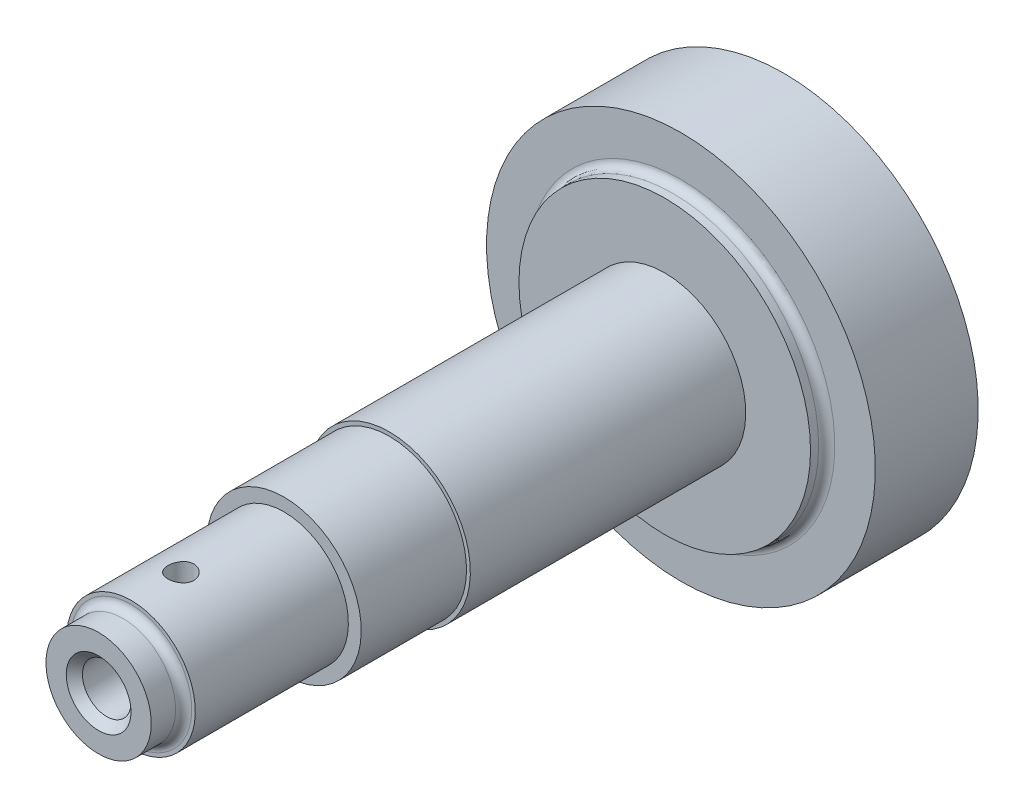
ISO-10303-21;
HEADER;
FILE_DESCRIPTION(('STEP AP214'),'2;1');
FILE_NAME('part.step','',(''),(''),'','','');
FILE_SCHEMA(('AUTOMOTIVE_DESIGN { 1 0 10303 214 1 1 1 1 }'));
ENDSEC;
DATA;
#1=APPLICATION_CONTEXT('core data for automotive mechanical design processes');
#2=APPLICATION_PROTOCOL_DEFINITION('international standard','automotive_design',2000,#1);
#3=PRODUCT_CONTEXT('',#1,'mechanical');
#4=PRODUCT('Part','Part','',(#3));
#5=PRODUCT_RELATED_PRODUCT_CATEGORY('part','',(#4));
#6=PRODUCT_DEFINITION_FORMATION('','',#4);
#7=PRODUCT_DEFINITION_CONTEXT('part definition',#1,'design');
#8=PRODUCT_DEFINITION('design','',#6,#7);
#9=PRODUCT_DEFINITION_SHAPE('','',#8);
#10=(LENGTH_UNIT() NAMED_UNIT(*) SI_UNIT(.MILLI.,.METRE.));
#11=(NAMED_UNIT(*) PLANE_ANGLE_UNIT() SI_UNIT($,.RADIAN.));
#12=(NAMED_UNIT(*) SI_UNIT($,.STERADIAN.) SOLID_ANGLE_UNIT());
#13=UNCERTAINTY_MEASURE_WITH_UNIT(LENGTH_MEASURE(1.E-05),#10,'distance_accuracy_value','');
#14=(GEOMETRIC_REPRESENTATION_CONTEXT(3) GLOBAL_UNCERTAINTY_ASSIGNED_CONTEXT((#13)) GLOBAL_UNIT_ASSIGNED_CONTEXT((#10,
#11,#12)) REPRESENTATION_CONTEXT('',''));
#15=CARTESIAN_POINT('',(0.,0.,0.));
#16=DIRECTION('',(0.,0.,1.));
#17=DIRECTION('',(1.,0.,0.));
#18=AXIS2_PLACEMENT_3D('',#15,#16,#17);
#19=CARTESIAN_POINT('',(0.,12.,-7.35));
#20=DIRECTION('',(0.,0.,-1.));
#21=DIRECTION('',(0.,1.,0.));
#22=AXIS2_PLACEMENT_3D('',#19,#20,#21);
#23=PLANE('',#22);
#24=CARTESIAN_POINT('',(0.,8.,-7.35));
#25=DIRECTION('',(0.,0.,-1.));
#26=DIRECTION('',(-1.,0.,0.));
#27=AXIS2_PLACEMENT_3D('',#24,#25,#26);
#28=CIRCLE('',#27,1.025);
#29=CARTESIAN_POINT('',(-1.025,8.,-7.35));
#30=VERTEX_POINT('',#29);
#31=EDGE_CURVE('E75',#30,#30,#28,.T.);
#32=ORIENTED_EDGE('',*,*,#31,.F.);
#33=EDGE_LOOP('',(#32));
#34=FACE_BOUND('',#33,.T.);
#35=CARTESIAN_POINT('',(6.92820323027551,4.,-7.35));
#36=DIRECTION('',(0.,0.,-1.));
#37=DIRECTION('',(-1.,0.,0.));
#38=AXIS2_PLACEMENT_3D('',#35,#36,#37);
#39=CIRCLE('',#38,1.025);
#40=CARTESIAN_POINT('',(5.90320323027551,4.,-7.35));
#41=VERTEX_POINT('',#40);
#42=EDGE_CURVE('E74',#41,#41,#39,.T.);
#43=ORIENTED_EDGE('',*,*,#42,.F.);
#44=EDGE_LOOP('',(#43));
#45=FACE_BOUND('',#44,.T.);
#46=CARTESIAN_POINT('',(6.92820323027551,-4.,-7.35));
#47=DIRECTION('',(0.,0.,-1.));
#48=DIRECTION('',(-1.,0.,0.));
#49=AXIS2_PLACEMENT_3D('',#46,#47,#48);
#50=CIRCLE('',#49,1.025);
#51=CARTESIAN_POINT('',(5.90320323027551,-4.,-7.35));
#52=VERTEX_POINT('',#51);
#53=EDGE_CURVE('E85',#52,#52,#50,.T.);
#54=ORIENTED_EDGE('',*,*,#53,.F.);
#55=EDGE_LOOP('',(#54));
#56=FACE_BOUND('',#55,.T.);
#57=CARTESIAN_POINT('',(0.,-8.,-7.35));
#58=DIRECTION('',(0.,0.,-1.));
#59=DIRECTION('',(-1.,0.,0.));
#60=AXIS2_PLACEMENT_3D('',#57,#58,#59);
#61=CIRCLE('',#60,1.025);
#62=CARTESIAN_POINT('',(-1.025,-8.,-7.35));
#63=VERTEX_POINT('',#62);
#64=EDGE_CURVE('E91',#63,#63,#61,.T.);
#65=ORIENTED_EDGE('',*,*,#64,.F.);
#66=EDGE_LOOP('',(#65));
#67=FACE_BOUND('',#66,.T.);
#68=CARTESIAN_POINT('',(-6.92820323027551,-4.,-7.35));
#69=DIRECTION('',(0.,0.,-1.));
#70=DIRECTION('',(-1.,0.,0.));
#71=AXIS2_PLACEMENT_3D('',#68,#69,#70);
#72=CIRCLE('',#71,1.025);
#73=CARTESIAN_POINT('',(-7.95320323027551,-4.,-7.35));
#74=VERTEX_POINT('',#73);
#75=EDGE_CURVE('E97',#74,#74,#72,.T.);
#76=ORIENTED_EDGE('',*,*,#75,.F.);
#77=EDGE_LOOP('',(#76));
#78=FACE_BOUND('',#77,.T.);
#79=CARTESIAN_POINT('',(-6.92820323027551,4.,-7.35));
#80=DIRECTION('',(0.,0.,-1.));
#81=DIRECTION('',(-1.,0.,0.));
#82=AXIS2_PLACEMENT_3D('',#79,#80,#81);
#83=CIRCLE('',#82,1.025);
#84=CARTESIAN_POINT('',(-7.95320323027551,4.,-7.35));
#85=VERTEX_POINT('',#84);
#86=EDGE_CURVE('E103',#85,#85,#83,.T.);
#87=ORIENTED_EDGE('',*,*,#86,.F.);
#88=EDGE_LOOP('',(#87));
#89=FACE_BOUND('',#88,.T.);
#90=CARTESIAN_POINT('',(0.,0.,-7.35));
#91=DIRECTION('',(0.,0.,-1.));
#92=DIRECTION('',(0.,1.,0.));
#93=AXIS2_PLACEMENT_3D('',#90,#91,#92);
#94=CIRCLE('',#93,12.);
#95=CARTESIAN_POINT('',(0.,12.,-7.35));
#96=VERTEX_POINT('',#95);
#97=EDGE_CURVE('E117',#96,#96,#94,.T.);
#98=ORIENTED_EDGE('',*,*,#97,.T.);
#99=EDGE_LOOP('',(#98));
#100=FACE_BOUND('',#99,.T.);
#101=ADVANCED_FACE('F37',(#34,#45,#56,#67,#78,#89,#100),#23,.T.);
#102=CARTESIAN_POINT('',(0.,0.,23.949));
#103=DIRECTION('',(0.,0.,1.));
#104=DIRECTION('',(0.,-1.,0.));
#105=AXIS2_PLACEMENT_3D('',#102,#103,#104);
#106=PLANE('',#105);
#107=CARTESIAN_POINT('',(0.,0.,23.949));
#108=DIRECTION('',(0.,0.,-1.));
#109=DIRECTION('',(0.,1.,0.));
#110=AXIS2_PLACEMENT_3D('',#107,#108,#109);
#111=CIRCLE('',#110,1.5);
#112=CARTESIAN_POINT('',(0.,1.5,23.949));
#113=VERTEX_POINT('',#112);
#114=EDGE_CURVE('E141',#113,#113,#111,.T.);
#115=ORIENTED_EDGE('',*,*,#114,.F.);
#116=EDGE_LOOP('',(#115));
#117=FACE_BOUND('',#116,.T.);
#118=ADVANCED_FACE('F151',(#117),#106,.T.);
#119=CARTESIAN_POINT('',(0.,0.,-7.35));
#120=DIRECTION('',(0.,0.,-1.));
#121=DIRECTION('',(0.,1.,0.));
#122=AXIS2_PLACEMENT_3D('',#119,#120,#121);
#123=CYLINDRICAL_SURFACE('',#122,1.5);
#124=CARTESIAN_POINT('',(0.,0.,34.449));
#125=DIRECTION('',(0.,0.,1.));
#126=DIRECTION('',(0.,-1.,0.));
#127=AXIS2_PLACEMENT_3D('',#124,#125,#126);
#128=CIRCLE('',#127,1.5);
#129=CARTESIAN_POINT('',(0.,-1.5,34.449));
#130=VERTEX_POINT('',#129);
#131=EDGE_CURVE('E11',#130,#130,#128,.T.);
#132=ORIENTED_EDGE('',*,*,#131,.T.);
#133=EDGE_LOOP('',(#132));
#134=FACE_BOUND('',#133,.T.);
#135=CARTESIAN_POINT('',(0.,1.5,30.669));
#136=CARTESIAN_POINT('',(-0.0417140042937087,1.49999758414449,30.6689972917102));
#137=CARTESIAN_POINT('',(-0.0834672912539163,1.49824189360224,30.6657184035876));
#138=CARTESIAN_POINT('',(-0.165718197334507,1.49139129667971,30.6527582991339));
#139=CARTESIAN_POINT('',(-0.206213769841146,1.48629121869364,30.6430671669965));
#140=CARTESIAN_POINT('',(-0.284638594945808,1.47328036800654,30.6177801601417));
#141=CARTESIAN_POINT('',(-0.322577512237569,1.465380979915,30.6022081858101));
#142=CARTESIAN_POINT('',(-0.395235474229208,1.4474774987237,30.565737448288));
#143=CARTESIAN_POINT('',(-0.42995450431626,1.43747339607276,30.5448386609244));
#144=CARTESIAN_POINT('',(-0.497767319459635,1.41547900666031,30.4967484382682));
#145=CARTESIAN_POINT('',(-0.530602027463181,1.4034011481073,30.4692323964802));
#146=CARTESIAN_POINT('',(-0.591434030661648,1.37887042167267,30.4093968543132));
#147=CARTESIAN_POINT('',(-0.619427089896361,1.36641723648963,30.3770731932663));
#148=CARTESIAN_POINT('',(-0.672354419511093,1.34122140682262,30.3050219415222));
#149=CARTESIAN_POINT('',(-0.696776837026739,1.32855595701366,30.2648879513369));
#150=CARTESIAN_POINT('',(-0.73842641631699,1.30586838669548,30.1803543186488));
#151=CARTESIAN_POINT('',(-0.755659138193525,1.29584422578236,30.1359580051932));
#152=CARTESIAN_POINT('',(-0.781243551670874,1.28057394848523,30.0469457306387));
#153=CARTESIAN_POINT('',(-0.790083117424783,1.27506829565278,30.0025170279096));
#154=CARTESIAN_POINT('',(-0.800094972405441,1.26881331156942,29.9124961280342));
#155=CARTESIAN_POINT('',(-0.801276946959546,1.26805797215382,29.8669054738658));
#156=CARTESIAN_POINT('',(-0.796296021649245,1.27118648805135,29.7827781343534));
#157=CARTESIAN_POINT('',(-0.791143222976698,1.2744325135639,29.7441515533778));
#158=CARTESIAN_POINT('',(-0.775413455073676,1.28406317281932,29.668425376058));
#159=CARTESIAN_POINT('',(-0.76483430375753,1.29044906914779,29.6313264004943));
#160=CARTESIAN_POINT('',(-0.738390252390656,1.30576277857079,29.5586619734264));
#161=CARTESIAN_POINT('',(-0.722411944930868,1.31474447400447,29.523149696915));
#162=CARTESIAN_POINT('',(-0.685716522966981,1.33425047082889,29.4551304736426));
#163=CARTESIAN_POINT('',(-0.664997308543684,1.34477545505385,29.422624867631));
#164=CARTESIAN_POINT('',(-0.615868522436837,1.36804524940245,29.3565141387867));
#165=CARTESIAN_POINT('',(-0.586776291159886,1.38088899493241,29.3234492647533));
#166=CARTESIAN_POINT('',(-0.523451373374347,1.40611558623123,29.2624246423101));
#167=CARTESIAN_POINT('',(-0.489215573049457,1.41849814710228,29.2344680092069));
#168=CARTESIAN_POINT('',(-0.414022077031174,1.44230010999534,29.1828622850858));
#169=CARTESIAN_POINT('',(-0.372785484410786,1.45361823088172,29.1595688918061));
#170=CARTESIAN_POINT('',(-0.28622685973614,1.47310395304255,29.1204521168231));
#171=CARTESIAN_POINT('',(-0.240908517249554,1.48127436501701,29.1046220679969));
#172=CARTESIAN_POINT('',(-0.151832213955903,1.4929099561423,29.0823223875927));
#173=CARTESIAN_POINT('',(-0.108300131382029,1.49673204992476,29.07513929869));
#174=CARTESIAN_POINT('',(-0.0204895975412021,1.50050221027201,29.0680524967996));
#175=CARTESIAN_POINT('',(0.0237884072844016,1.5004525171609,29.0681445741977));
#176=CARTESIAN_POINT('',(0.107545959760608,1.49667382258832,29.0752499288307));
#177=CARTESIAN_POINT('',(0.147096449267732,1.49327897244286,29.0816346407483));
#178=CARTESIAN_POINT('',(0.224469554831582,1.48362188327846,29.1001074420979));
#179=CARTESIAN_POINT('',(0.262291990687246,1.47735934596486,29.1121961248567));
#180=CARTESIAN_POINT('',(0.336250167522201,1.46232570811689,29.1419749424682));
#181=CARTESIAN_POINT('',(0.372320333376868,1.4534959496239,29.1597972349183));
#182=CARTESIAN_POINT('',(0.44106215741096,1.43413438081761,29.2003751543016));
#183=CARTESIAN_POINT('',(0.473732482002723,1.42360190671964,29.2231327063769));
#184=CARTESIAN_POINT('',(0.538489644606409,1.40047645695353,29.2757448011077));
#185=CARTESIAN_POINT('',(0.57013486510825,1.38778372966929,29.3060996673289));
#186=CARTESIAN_POINT('',(0.628109862741499,1.36252708549313,29.3716128359152));
#187=CARTESIAN_POINT('',(0.654434715474707,1.34996329805962,29.4067755382921));
#188=CARTESIAN_POINT('',(0.702740766308904,1.32549514327965,29.483826486175));
#189=CARTESIAN_POINT('',(0.724310244689168,1.31369210729127,29.5260081387794));
#190=CARTESIAN_POINT('',(0.759824848176566,1.29347935062968,29.6142100900862));
#191=CARTESIAN_POINT('',(0.773780830369474,1.28506480237657,29.6602248141217));
#192=CARTESIAN_POINT('',(0.792295451806944,1.27372513461019,29.7500138470975));
#193=CARTESIAN_POINT('',(0.797640611545236,1.27034308682665,29.7935661837155));
#194=CARTESIAN_POINT('',(0.801103834511677,1.26816359887642,29.8810603141804));
#195=CARTESIAN_POINT('',(0.799226824740032,1.26936303319563,29.9250018221226));
#196=CARTESIAN_POINT('',(0.789056350744171,1.27570247677833,30.0063463548581));
#197=CARTESIAN_POINT('',(0.781570591370396,1.28034575552508,30.0438948907275));
#198=CARTESIAN_POINT('',(0.761493436479315,1.29238691721072,30.1171339575411));
#199=CARTESIAN_POINT('',(0.748900147495975,1.29978582163339,30.1528237938842));
#200=CARTESIAN_POINT('',(0.718080352112412,1.3170766557443,30.2239047795466));
#201=CARTESIAN_POINT('',(0.699543207429625,1.32709848411839,30.2591285674158));
#202=CARTESIAN_POINT('',(0.657671226676279,1.34833960706443,30.3262019357598));
#203=CARTESIAN_POINT('',(0.634333807313358,1.35955954483521,30.3580496853594));
#204=CARTESIAN_POINT('',(0.57958360263346,1.38387269806828,30.4222730938803));
#205=CARTESIAN_POINT('',(0.547491018352172,1.39700212075101,30.4540587404488));
#206=CARTESIAN_POINT('',(0.478150164559813,1.42222830059072,30.5119722703881));
#207=CARTESIAN_POINT('',(0.440898582826818,1.43432438618419,30.5380964911038));
#208=CARTESIAN_POINT('',(0.361022002622193,1.45651015109521,30.5844339599367));
#209=CARTESIAN_POINT('',(0.318288665753903,1.4665441059256,30.6044886264249));
#210=CARTESIAN_POINT('',(0.229399331630392,1.48303856571174,30.6368536227339));
#211=CARTESIAN_POINT('',(0.183252846928629,1.48950860714735,30.6491846321223));
#212=CARTESIAN_POINT('',(0.113807677907479,1.49584776109146,30.6611926712721));
#213=CARTESIAN_POINT('',(0.0911777471195367,1.49739944315896,30.6641148842016));
#214=CARTESIAN_POINT('',(0.0457024774465205,1.49947623062919,30.6680193021585));
#215=CARTESIAN_POINT('',(0.0228571359907302,1.50000132376497,30.669001484004));
#216=CARTESIAN_POINT('',(0.,1.5,30.669));
#217=B_SPLINE_CURVE_WITH_KNOTS('',3,(#135,#136,#137,#138,#139,#140,#141,#142,#143,#144,#145,
#146,#147,#148,#149,#150,#151,#152,#153,#154,#155,#156,#157,#158,#159,#160,#161,#162,#163,#164,
#165,#166,#167,#168,#169,#170,#171,#172,#173,#174,#175,#176,#177,#178,#179,#180,#181,#182,#183,
#184,#185,#186,#187,#188,#189,#190,#191,#192,#193,#194,#195,#196,#197,#198,#199,#200,#201,#202,
#203,#204,#205,#206,#207,#208,#209,#210,#211,#212,#213,#214,#215,#216),.UNSPECIFIED.,.T.,.F.,(4,
2,2,2,2,2,2,2,2,2,2,2,2,2,2,2,2,2,2,2,2,2,2,2,2,2,2,2,2,2,2,2,2,2,2,2,2,2,2,2,4),(0.,
0.125049785968991,0.250293400579705,0.375033395431374,0.499773956363365,0.632758937517722,
0.765859685119305,0.911100210896846,1.05622820677189,1.19228300426692,1.3281656858967,
1.44492819552125,1.56173769541658,1.68117137196063,1.80065805275815,1.93770170276476,
2.07482865313355,2.22012229846779,2.36528590361977,2.49740165319179,2.62944095746672,
2.74950324975933,2.86957803367864,2.99264692026342,3.11576390008817,3.25213772585138,
3.38863720347792,3.5343258453474,3.67980618389776,3.81103787448888,3.94218005404201,
4.05738088818265,4.1726244687305,4.29529226385598,4.41802624681403,4.55851375899378,
4.69909188991151,4.84307664846749,4.98667423094962,5.05519428454417,5.12371515689629),.UNSPECIFIED.);
#218=CARTESIAN_POINT('',(0.,1.5,30.669));
#219=VERTEX_POINT('',#218);
#220=EDGE_CURVE('E109',#219,#219,#217,.T.);
#221=ORIENTED_EDGE('',*,*,#220,.F.);
#222=EDGE_LOOP('',(#221));
#223=FACE_BOUND('',#222,.T.);
#224=ORIENTED_EDGE('',*,*,#114,.T.);
#225=EDGE_LOOP('',(#224));
#226=FACE_BOUND('',#225,.T.);
#227=ADVANCED_FACE('F145',(#134,#223,#226),#123,.F.);
#228=CARTESIAN_POINT('',(0.,1.5,34.949));
#229=DIRECTION('',(0.,0.,1.));
#230=DIRECTION('',(0.,-1.,0.));
#231=AXIS2_PLACEMENT_3D('',#228,#229,#230);
#232=PLANE('',#231);
#233=CARTESIAN_POINT('',(0.,0.,34.949));
#234=DIRECTION('',(0.,0.,1.));
#235=DIRECTION('',(0.,-1.,0.));
#236=AXIS2_PLACEMENT_3D('',#233,#234,#235);
#237=CIRCLE('',#236,1.99999999999999);
#238=CARTESIAN_POINT('',(0.,-1.99999999999999,34.949));
#239=VERTEX_POINT('',#238);
#240=EDGE_CURVE('E45',#239,#239,#237,.F.);
#241=ORIENTED_EDGE('',*,*,#240,.T.);
#242=EDGE_LOOP('',(#241));
#243=FACE_BOUND('',#242,.T.);
#244=CARTESIAN_POINT('',(0.,0.,34.949));
#245=DIRECTION('',(0.,0.,-1.));
#246=DIRECTION('',(0.,1.,0.));
#247=AXIS2_PLACEMENT_3D('',#244,#245,#246);
#248=CIRCLE('',#247,3.25);
#249=CARTESIAN_POINT('',(0.,3.25,34.949));
#250=VERTEX_POINT('',#249);
#251=EDGE_CURVE('E176',#250,#250,#248,.T.);
#252=ORIENTED_EDGE('',*,*,#251,.F.);
#253=EDGE_LOOP('',(#252));
#254=FACE_BOUND('',#253,.T.);
#255=ADVANCED_FACE('F150',(#243,#254),#232,.T.);
#256=CARTESIAN_POINT('',(0.,0.,-7.35));
#257=DIRECTION('',(0.,0.,-1.));
#258=DIRECTION('',(0.,1.,0.));
#259=AXIS2_PLACEMENT_3D('',#256,#257,#258);
#260=CYLINDRICAL_SURFACE('',#259,3.25);
#261=ORIENTED_EDGE('',*,*,#251,.T.);
#262=EDGE_LOOP('',(#261));
#263=FACE_BOUND('',#262,.T.);
#264=CARTESIAN_POINT('',(0.,0.,33.449));
#265=DIRECTION('',(0.,0.,-1.));
#266=DIRECTION('',(0.,1.,0.));
#267=AXIS2_PLACEMENT_3D('',#264,#265,#266);
#268=CIRCLE('',#267,3.25);
#269=CARTESIAN_POINT('',(0.,3.25,33.449));
#270=VERTEX_POINT('',#269);
#271=EDGE_CURVE('E180',#270,#270,#268,.T.);
#272=ORIENTED_EDGE('',*,*,#271,.F.);
#273=EDGE_LOOP('',(#272));
#274=FACE_BOUND('',#273,.T.);
#275=ADVANCED_FACE('F281',(#263,#274),#260,.T.);
#276=CARTESIAN_POINT('',(0.,0.,33.449));
#277=DIRECTION('',(0.,0.,-1.));
#278=DIRECTION('',(0.,1.,0.));
#279=AXIS2_PLACEMENT_3D('',#276,#277,#278);
#280=TOROIDAL_SURFACE('',#279,3.75,0.5);
#281=ORIENTED_EDGE('',*,*,#271,.T.);
#282=EDGE_LOOP('',(#281));
#283=FACE_BOUND('',#282,.T.);
#284=CARTESIAN_POINT('',(0.,0.,32.949));
#285=DIRECTION('',(0.,0.,-1.));
#286=DIRECTION('',(0.,1.,0.));
#287=AXIS2_PLACEMENT_3D('',#284,#285,#286);
#288=CIRCLE('',#287,3.75);
#289=CARTESIAN_POINT('',(0.,3.75,32.949));
#290=VERTEX_POINT('',#289);
#291=EDGE_CURVE('E184',#290,#290,#288,.T.);
#292=ORIENTED_EDGE('',*,*,#291,.F.);
#293=EDGE_LOOP('',(#292));
#294=FACE_BOUND('',#293,.T.);
#295=ADVANCED_FACE('F269',(#283,#294),#280,.F.);
#296=CARTESIAN_POINT('',(0.,3.96875,32.949));
#297=DIRECTION('',(0.,0.,1.));
#298=DIRECTION('',(0.,-1.,0.));
#299=AXIS2_PLACEMENT_3D('',#296,#297,#298);
#300=PLANE('',#299);
#301=ORIENTED_EDGE('',*,*,#291,.T.);
#302=EDGE_LOOP('',(#301));
#303=FACE_BOUND('',#302,.T.);
#304=CARTESIAN_POINT('',(0.,0.,32.949));
#305=DIRECTION('',(0.,0.,-1.));
#306=DIRECTION('',(0.,1.,0.));
#307=AXIS2_PLACEMENT_3D('',#304,#305,#306);
#308=CIRCLE('',#307,3.96875);
#309=CARTESIAN_POINT('',(0.,3.96875,32.949));
#310=VERTEX_POINT('',#309);
#311=EDGE_CURVE('E189',#310,#310,#308,.T.);
#312=ORIENTED_EDGE('',*,*,#311,.F.);
#313=EDGE_LOOP('',(#312));
#314=FACE_BOUND('',#313,.T.);
#315=ADVANCED_FACE('F251',(#303,#314),#300,.T.);
#316=CARTESIAN_POINT('',(0.,0.,-7.35));
#317=DIRECTION('',(0.,0.,-1.));
#318=DIRECTION('',(0.,1.,0.));
#319=AXIS2_PLACEMENT_3D('',#316,#317,#318);
#320=CYLINDRICAL_SURFACE('',#319,3.96875);
#321=CARTESIAN_POINT('',(0.,3.96875,30.669));
#322=CARTESIAN_POINT('',(0.0444541325131263,3.96874917972368,30.6689983734452));
#323=CARTESIAN_POINT('',(0.0889287519163532,3.96799544147647,30.6652821627834));
#324=CARTESIAN_POINT('',(0.176620377392282,3.96506134119661,30.6505276051741));
#325=CARTESIAN_POINT('',(0.219836364442538,3.96287985501559,30.6394834884487));
#326=CARTESIAN_POINT('',(0.30373021727012,3.95733379644308,30.6104285582664));
#327=CARTESIAN_POINT('',(0.344410488237865,3.95397036589777,30.5924244669888));
#328=CARTESIAN_POINT('',(0.422170230076708,3.94642584265588,30.549980745993));
#329=CARTESIAN_POINT('',(0.459249905300921,3.94224479640402,30.5255414817981));
#330=CARTESIAN_POINT('',(0.52926830912868,3.93346077328702,30.4705650453066));
#331=CARTESIAN_POINT('',(0.562150415665662,3.92885323426177,30.4399564806299));
#332=CARTESIAN_POINT('',(0.622349940950375,3.91976862926178,30.3736637614671));
#333=CARTESIAN_POINT('',(0.649666920357432,3.91529157361198,30.3379792066327));
#334=CARTESIAN_POINT('',(0.698202481791069,3.90693026014619,30.2621392537192));
#335=CARTESIAN_POINT('',(0.719362301034582,3.90305187034338,30.2219455447723));
#336=CARTESIAN_POINT('',(0.754606398350748,3.89639186148149,30.1384821806222));
#337=CARTESIAN_POINT('',(0.768691387122708,3.89361013226384,30.0952128348795));
#338=CARTESIAN_POINT('',(0.789201916149975,3.88950458459641,30.0074360660993));
#339=CARTESIAN_POINT('',(0.795726874426773,3.88816186061306,29.9629527761464));
#340=CARTESIAN_POINT('',(0.801240950700578,3.88702945680866,29.8735041463847));
#341=CARTESIAN_POINT('',(0.80023085170416,3.88723961561955,29.8285388571477));
#342=CARTESIAN_POINT('',(0.7907838366177,3.88917206009037,29.7401309329034));
#343=CARTESIAN_POINT('',(0.782461011653263,3.89087111532675,29.6966755228377));
#344=CARTESIAN_POINT('',(0.758804941359501,3.89555332182969,29.6117907042034));
#345=CARTESIAN_POINT('',(0.743471356462156,3.89853653529438,29.5703613938771));
#346=CARTESIAN_POINT('',(0.706120429450749,3.90547460612912,29.4903766568778));
#347=CARTESIAN_POINT('',(0.684057975609696,3.90943598610665,29.4518428855182));
#348=CARTESIAN_POINT('',(0.63390740356565,3.91787986991113,29.3789816852474));
#349=CARTESIAN_POINT('',(0.605818582364538,3.92236243450824,29.3446547478136));
#350=CARTESIAN_POINT('',(0.543802314362468,3.93144417655352,29.2805234169565));
#351=CARTESIAN_POINT('',(0.509777520815182,3.93604398777063,29.2508131696174));
#352=CARTESIAN_POINT('',(0.437178352292627,3.94476693655068,29.1975068024737));
#353=CARTESIAN_POINT('',(0.398603917196791,3.94889006781319,29.1739107634777));
#354=CARTESIAN_POINT('',(0.317895040256712,3.95620547187481,29.1334847320935));
#355=CARTESIAN_POINT('',(0.275754999553424,3.95939624430597,29.1166656289688));
#356=CARTESIAN_POINT('',(0.189168769126507,3.96447605023394,29.0903719647451));
#357=CARTESIAN_POINT('',(0.144722863981678,3.96636524395639,29.0808964996191));
#358=CARTESIAN_POINT('',(0.0555954736539724,3.96860667771273,29.0696926683514));
#359=CARTESIAN_POINT('',(0.0109308049647924,3.96898447194806,29.0678354812751));
#360=CARTESIAN_POINT('',(-0.0780706372445678,3.96823156977253,29.0715738134645));
#361=CARTESIAN_POINT('',(-0.122407429356478,3.96710095956321,29.0771689068509));
#362=CARTESIAN_POINT('',(-0.209078065787509,3.96347428738186,29.0955459673644));
#363=CARTESIAN_POINT('',(-0.251426523260813,3.96099081182107,29.1082617173619));
#364=CARTESIAN_POINT('',(-0.333390150399398,3.95493590011774,29.1404466865194));
#365=CARTESIAN_POINT('',(-0.373005112612033,3.95136438151169,29.1599164175837));
#366=CARTESIAN_POINT('',(-0.448919655844769,3.94346596430025,29.2053345252058));
#367=CARTESIAN_POINT('',(-0.485171989173552,3.9391302410398,29.2313603071432));
#368=CARTESIAN_POINT('',(-0.552841038146448,3.93020487738891,29.2890482362495));
#369=CARTESIAN_POINT('',(-0.58425722586039,3.92561520935122,29.320710997958));
#370=CARTESIAN_POINT('',(-0.641860361887284,3.91661292911103,29.3893609283369));
#371=CARTESIAN_POINT('',(-0.667958809066858,3.91220415880397,29.4264229484407));
#372=CARTESIAN_POINT('',(-0.713560284116662,3.90414481285551,29.5044804060495));
#373=CARTESIAN_POINT('',(-0.733063578019794,3.90049420663386,29.5454756848105));
#374=CARTESIAN_POINT('',(-0.764800908719841,3.89439567184802,29.6300280577704));
#375=CARTESIAN_POINT('',(-0.777072941015104,3.89194146895412,29.6735704158814));
#376=CARTESIAN_POINT('',(-0.794114339170052,3.88850047136446,29.7621539967124));
#377=CARTESIAN_POINT('',(-0.798884700914311,3.88751348188968,29.8071950196662));
#378=CARTESIAN_POINT('',(-0.800750033239184,3.8871295954836,29.8966085225453));
#379=CARTESIAN_POINT('',(-0.797984886832986,3.8877037188876,29.9409780187958));
#380=CARTESIAN_POINT('',(-0.785166744058513,3.8903125557533,30.0286054728597));
#381=CARTESIAN_POINT('',(-0.775113808298105,3.89234725706832,30.0718634399138));
#382=CARTESIAN_POINT('',(-0.748068281845036,3.8976349367444,30.1559491065688));
#383=CARTESIAN_POINT('',(-0.731093104677784,3.90088485642229,30.1967826119693));
#384=CARTESIAN_POINT('',(-0.690701123162848,3.9082384891047,30.2750437801395));
#385=CARTESIAN_POINT('',(-0.667283767798066,3.91234227513541,30.3124711512086));
#386=CARTESIAN_POINT('',(-0.614195510506858,3.9210297479312,30.3835536051715));
#387=CARTESIAN_POINT('',(-0.584423694542847,3.92562049237832,30.4171324712213));
#388=CARTESIAN_POINT('',(-0.519679667473879,3.93471423427265,30.4788639735284));
#389=CARTESIAN_POINT('',(-0.48470626257864,3.93921721130777,30.5070153607378));
#390=CARTESIAN_POINT('',(-0.410103641549803,3.94768469080049,30.5573765379579));
#391=CARTESIAN_POINT('',(-0.370428764010117,3.95164294066083,30.5795197837093));
#392=CARTESIAN_POINT('',(-0.287852107257284,3.95851335091306,30.6167896141199));
#393=CARTESIAN_POINT('',(-0.244953260687329,3.9614264484122,30.6319224880011));
#394=CARTESIAN_POINT('',(-0.168301829740705,3.96531610318129,30.6518299774724));
#395=CARTESIAN_POINT('',(-0.134983949151324,3.96659624339982,30.6582571923016));
#396=CARTESIAN_POINT('',(-0.0677813371128765,3.96831349072551,30.6668427537295));
#397=CARTESIAN_POINT('',(-0.0338966242817849,3.96875062546711,30.6690012402608));
#398=CARTESIAN_POINT('',(0.,3.96875,30.669));
#399=B_SPLINE_CURVE_WITH_KNOTS('',3,(#321,#322,#323,#324,#325,#326,#327,#328,#329,#330,#331,
#332,#333,#334,#335,#336,#337,#338,#339,#340,#341,#342,#343,#344,#345,#346,#347,#348,#349,#350,
#351,#352,#353,#354,#355,#356,#357,#358,#359,#360,#361,#362,#363,#364,#365,#366,#367,#368,#369,
#370,#371,#372,#373,#374,#375,#376,#377,#378,#379,#380,#381,#382,#383,#384,#385,#386,#387,#388,
#389,#390,#391,#392,#393,#394,#395,#396,#397,#398),.UNSPECIFIED.,.T.,.F.,(4,2,2,2,2,2,2,2,2,2,2,
2,2,2,2,2,2,2,2,2,2,2,2,2,2,2,2,2,2,2,2,2,2,2,2,2,2,2,4),(0.,0.133238387862618,
0.266581808407222,0.399796761834612,0.533004150174661,0.66785206219706,0.802710615707569,
0.938816923247824,1.07490955554683,1.2091914300447,1.3434593508164,1.47566893288879,
1.60788491924588,1.74100755484278,1.874145728141,2.00971774433272,2.14529155222158,
2.28108234127666,2.41685641136233,2.55032490674934,2.68378577507268,2.81602568152115,
2.94827561301481,3.08216685186024,3.21607269638155,3.35205192660189,3.48802567108688,
3.62327844122572,3.75851325436142,3.89125486258965,4.02399536690379,4.15640399038496,
4.28882394266045,4.42352834547016,4.55826371144608,4.69443551776024,4.83048492241114,
4.93208356745346,5.03367888194883),.UNSPECIFIED.);
#400=CARTESIAN_POINT('',(0.,3.96875,30.669));
#401=VERTEX_POINT('',#400);
#402=EDGE_CURVE('E110',#401,#401,#399,.T.);
#403=ORIENTED_EDGE('',*,*,#402,.F.);
#404=EDGE_LOOP('',(#403));
#405=FACE_BOUND('',#404,.T.);
#406=ORIENTED_EDGE('',*,*,#311,.T.);
#407=EDGE_LOOP('',(#406));
#408=FACE_BOUND('',#407,.T.);
#409=CARTESIAN_POINT('',(0.,0.,23.5));
#410=DIRECTION('',(0.,0.,-1.));
#411=DIRECTION('',(0.,1.,0.));
#412=AXIS2_PLACEMENT_3D('',#409,#410,#411);
#413=CIRCLE('',#412,3.96875);
#414=CARTESIAN_POINT('',(0.,3.96875,23.5));
#415=VERTEX_POINT('',#414);
#416=EDGE_CURVE('E192',#415,#415,#413,.T.);
#417=ORIENTED_EDGE('',*,*,#416,.F.);
#418=EDGE_LOOP('',(#417));
#419=FACE_BOUND('',#418,.T.);
#420=ADVANCED_FACE('F119',(#405,#408,#419),#320,.T.);
#421=CARTESIAN_POINT('',(0.,4.7625,23.5));
#422=DIRECTION('',(0.,0.,1.));
#423=DIRECTION('',(0.,-1.,0.));
#424=AXIS2_PLACEMENT_3D('',#421,#422,#423);
#425=PLANE('',#424);
#426=ORIENTED_EDGE('',*,*,#416,.T.);
#427=EDGE_LOOP('',(#426));
#428=FACE_BOUND('',#427,.T.);
#429=CARTESIAN_POINT('',(0.,0.,23.5));
#430=DIRECTION('',(0.,0.,-1.));
#431=DIRECTION('',(0.,1.,0.));
#432=AXIS2_PLACEMENT_3D('',#429,#430,#431);
#433=CIRCLE('',#432,4.7625);
#434=CARTESIAN_POINT('',(0.,4.7625,23.5));
#435=VERTEX_POINT('',#434);
#436=EDGE_CURVE('E195',#435,#435,#433,.T.);
#437=ORIENTED_EDGE('',*,*,#436,.F.);
#438=EDGE_LOOP('',(#437));
#439=FACE_BOUND('',#438,.T.);
#440=ADVANCED_FACE('F244',(#428,#439),#425,.T.);
#441=CARTESIAN_POINT('',(0.,0.,-7.35));
#442=DIRECTION('',(0.,0.,-1.));
#443=DIRECTION('',(0.,1.,0.));
#444=AXIS2_PLACEMENT_3D('',#441,#442,#443);
#445=CYLINDRICAL_SURFACE('',#444,4.7625);
#446=ORIENTED_EDGE('',*,*,#436,.T.);
#447=EDGE_LOOP('',(#446));
#448=FACE_BOUND('',#447,.T.);
#449=CARTESIAN_POINT('',(0.,0.,17.));
#450=DIRECTION('',(0.,0.,-1.));
#451=DIRECTION('',(0.,1.,0.));
#452=AXIS2_PLACEMENT_3D('',#449,#450,#451);
#453=CIRCLE('',#452,4.7625);
#454=CARTESIAN_POINT('',(0.,4.7625,17.));
#455=VERTEX_POINT('',#454);
#456=EDGE_CURVE('E198',#455,#455,#453,.T.);
#457=ORIENTED_EDGE('',*,*,#456,.F.);
#458=EDGE_LOOP('',(#457));
#459=FACE_BOUND('',#458,.T.);
#460=ADVANCED_FACE('F241',(#448,#459),#445,.T.);
#461=CARTESIAN_POINT('',(0.,5.,17.));
#462=DIRECTION('',(0.,0.,1.));
#463=DIRECTION('',(0.,-1.,0.));
#464=AXIS2_PLACEMENT_3D('',#461,#462,#463);
#465=PLANE('',#464);
#466=ORIENTED_EDGE('',*,*,#456,.T.);
#467=EDGE_LOOP('',(#466));
#468=FACE_BOUND('',#467,.T.);
#469=CARTESIAN_POINT('',(0.,0.,17.));
#470=DIRECTION('',(0.,0.,-1.));
#471=DIRECTION('',(0.,1.,0.));
#472=AXIS2_PLACEMENT_3D('',#469,#470,#471);
#473=CIRCLE('',#472,5.);
#474=CARTESIAN_POINT('',(0.,5.,17.));
#475=VERTEX_POINT('',#474);
#476=EDGE_CURVE('E201',#475,#475,#473,.T.);
#477=ORIENTED_EDGE('',*,*,#476,.F.);
#478=EDGE_LOOP('',(#477));
#479=FACE_BOUND('',#478,.T.);
#480=ADVANCED_FACE('F237',(#468,#479),#465,.T.);
#481=CARTESIAN_POINT('',(0.,0.,-7.35));
#482=DIRECTION('',(0.,0.,-1.));
#483=DIRECTION('',(0.,1.,0.));
#484=AXIS2_PLACEMENT_3D('',#481,#482,#483);
#485=CYLINDRICAL_SURFACE('',#484,5.);
#486=ORIENTED_EDGE('',*,*,#476,.T.);
#487=EDGE_LOOP('',(#486));
#488=FACE_BOUND('',#487,.T.);
#489=CARTESIAN_POINT('',(0.,0.,0.));
#490=DIRECTION('',(0.,0.,-1.));
#491=DIRECTION('',(0.,1.,0.));
#492=AXIS2_PLACEMENT_3D('',#489,#490,#491);
#493=CIRCLE('',#492,5.);
#494=CARTESIAN_POINT('',(0.,5.,0.));
#495=VERTEX_POINT('',#494);
#496=EDGE_CURVE('E204',#495,#495,#493,.T.);
#497=ORIENTED_EDGE('',*,*,#496,.F.);
#498=EDGE_LOOP('',(#497));
#499=FACE_BOUND('',#498,.T.);
#500=ADVANCED_FACE('F233',(#488,#499),#485,.T.);
#501=CARTESIAN_POINT('',(0.,9.,0.));
#502=DIRECTION('',(0.,0.,1.));
#503=DIRECTION('',(0.,-1.,0.));
#504=AXIS2_PLACEMENT_3D('',#501,#502,#503);
#505=PLANE('',#504);
#506=ORIENTED_EDGE('',*,*,#496,.T.);
#507=EDGE_LOOP('',(#506));
#508=FACE_BOUND('',#507,.T.);
#509=CARTESIAN_POINT('',(0.,0.,0.));
#510=DIRECTION('',(0.,0.,-1.));
#511=DIRECTION('',(0.,1.,0.));
#512=AXIS2_PLACEMENT_3D('',#509,#510,#511);
#513=CIRCLE('',#512,9.);
#514=CARTESIAN_POINT('',(0.,9.,0.));
#515=VERTEX_POINT('',#514);
#516=EDGE_CURVE('E207',#515,#515,#513,.T.);
#517=ORIENTED_EDGE('',*,*,#516,.F.);
#518=EDGE_LOOP('',(#517));
#519=FACE_BOUND('',#518,.T.);
#520=ADVANCED_FACE('F226',(#508,#519),#505,.T.);
#521=CARTESIAN_POINT('',(0.,0.,-7.35));
#522=DIRECTION('',(0.,0.,-1.));
#523=DIRECTION('',(0.,1.,0.));
#524=AXIS2_PLACEMENT_3D('',#521,#522,#523);
#525=CYLINDRICAL_SURFACE('',#524,9.);
#526=CARTESIAN_POINT('',(0.,0.,-0.5));
#527=DIRECTION('',(0.,0.,1.));
#528=DIRECTION('',(0.,-1.,0.));
#529=AXIS2_PLACEMENT_3D('',#526,#527,#528);
#530=CIRCLE('',#529,9.);
#531=CARTESIAN_POINT('',(0.,-9.,-0.5));
#532=VERTEX_POINT('',#531);
#533=EDGE_CURVE('E171',#532,#532,#530,.T.);
#534=ORIENTED_EDGE('',*,*,#533,.T.);
#535=EDGE_LOOP('',(#534));
#536=FACE_BOUND('',#535,.T.);
#537=ORIENTED_EDGE('',*,*,#516,.T.);
#538=EDGE_LOOP('',(#537));
#539=FACE_BOUND('',#538,.T.);
#540=ADVANCED_FACE('F222',(#536,#539),#525,.T.);
#541=CARTESIAN_POINT('',(0.,9.,-1.));
#542=DIRECTION('',(0.,0.,1.));
#543=DIRECTION('',(0.,-1.,0.));
#544=AXIS2_PLACEMENT_3D('',#541,#542,#543);
#545=PLANE('',#544);
#546=CARTESIAN_POINT('',(0.,0.,-1.));
#547=DIRECTION('',(0.,0.,1.));
#548=DIRECTION('',(0.,-1.,0.));
#549=AXIS2_PLACEMENT_3D('',#546,#547,#548);
#550=CIRCLE('',#549,9.5);
#551=CARTESIAN_POINT('',(0.,-9.5,-1.));
#552=VERTEX_POINT('',#551);
#553=EDGE_CURVE('E143',#552,#552,#550,.F.);
#554=ORIENTED_EDGE('',*,*,#553,.T.);
#555=EDGE_LOOP('',(#554));
#556=FACE_BOUND('',#555,.T.);
#557=CARTESIAN_POINT('',(0.,0.,-1.));
#558=DIRECTION('',(0.,0.,-1.));
#559=DIRECTION('',(0.,1.,0.));
#560=AXIS2_PLACEMENT_3D('',#557,#558,#559);
#561=CIRCLE('',#560,12.);
#562=CARTESIAN_POINT('',(0.,12.,-1.));
#563=VERTEX_POINT('',#562);
#564=EDGE_CURVE('E209',#563,#563,#561,.T.);
#565=ORIENTED_EDGE('',*,*,#564,.F.);
#566=EDGE_LOOP('',(#565));
#567=FACE_BOUND('',#566,.T.);
#568=ADVANCED_FACE('F218',(#556,#567),#545,.T.);
#569=CARTESIAN_POINT('',(0.,0.,-7.35));
#570=DIRECTION('',(0.,0.,-1.));
#571=DIRECTION('',(0.,1.,0.));
#572=AXIS2_PLACEMENT_3D('',#569,#570,#571);
#573=CYLINDRICAL_SURFACE('',#572,12.);
#574=ORIENTED_EDGE('',*,*,#564,.T.);
#575=EDGE_LOOP('',(#574));
#576=FACE_BOUND('',#575,.T.);
#577=ORIENTED_EDGE('',*,*,#97,.F.);
#578=EDGE_LOOP('',(#577));
#579=FACE_BOUND('',#578,.T.);
#580=ADVANCED_FACE('F129',(#576,#579),#573,.T.);
#581=CARTESIAN_POINT('',(0.,0.,29.869));
#582=DIRECTION('',(0.,-1.,0.));
#583=DIRECTION('',(0.,0.,-1.));
#584=AXIS2_PLACEMENT_3D('',#581,#582,#583);
#585=CYLINDRICAL_SURFACE('',#584,0.799999999999993);
#586=ORIENTED_EDGE('',*,*,#402,.T.);
#587=EDGE_LOOP('',(#586));
#588=FACE_BOUND('',#587,.T.);
#589=ORIENTED_EDGE('',*,*,#220,.T.);
#590=EDGE_LOOP('',(#589));
#591=FACE_BOUND('',#590,.T.);
#592=ADVANCED_FACE('F123',(#588,#591),#585,.F.);
#593=CARTESIAN_POINT('',(-6.92820323027551,4.,-2.));
#594=DIRECTION('',(0.,0.,-1.));
#595=DIRECTION('',(-1.,0.,0.));
#596=AXIS2_PLACEMENT_3D('',#593,#594,#595);
#597=CONICAL_SURFACE('',#596,1.025,1.02974425867665);
#598=CARTESIAN_POINT('',(-6.92820323027551,4.,-1.38411786549675));
#599=VERTEX_POINT('',#598);
#600=VERTEX_LOOP('',#599);
#601=FACE_BOUND('',#600,.T.);
#602=CARTESIAN_POINT('',(-6.92820323027551,4.,-2.));
#603=DIRECTION('',(0.,0.,-1.));
#604=DIRECTION('',(-1.,0.,0.));
#605=AXIS2_PLACEMENT_3D('',#602,#603,#604);
#606=CIRCLE('',#605,1.025);
#607=CARTESIAN_POINT('',(-7.95320323027551,4.,-2.));
#608=VERTEX_POINT('',#607);
#609=EDGE_CURVE('E106',#608,#608,#606,.T.);
#610=ORIENTED_EDGE('',*,*,#609,.T.);
#611=EDGE_LOOP('',(#610));
#612=FACE_BOUND('',#611,.T.);
#613=ADVANCED_FACE('F128',(#601,#612),#597,.F.);
#614=CARTESIAN_POINT('',(-6.92820323027551,4.,-7.35));
#615=DIRECTION('',(0.,0.,-1.));
#616=DIRECTION('',(-1.,0.,0.));
#617=AXIS2_PLACEMENT_3D('',#614,#615,#616);
#618=CYLINDRICAL_SURFACE('',#617,1.025);
#619=ORIENTED_EDGE('',*,*,#609,.F.);
#620=EDGE_LOOP('',(#619));
#621=FACE_BOUND('',#620,.T.);
#622=ORIENTED_EDGE('',*,*,#86,.T.);
#623=EDGE_LOOP('',(#622));
#624=FACE_BOUND('',#623,.T.);
#625=ADVANCED_FACE('F398',(#621,#624),#618,.F.);
#626=CARTESIAN_POINT('',(-6.92820323027551,-4.,-2.));
#627=DIRECTION('',(0.,0.,-1.));
#628=DIRECTION('',(-1.,0.,0.));
#629=AXIS2_PLACEMENT_3D('',#626,#627,#628);
#630=CONICAL_SURFACE('',#629,1.025,1.02974425867665);
#631=CARTESIAN_POINT('',(-6.92820323027551,-4.,-1.38411786549675));
#632=VERTEX_POINT('',#631);
#633=VERTEX_LOOP('',#632);
#634=FACE_BOUND('',#633,.T.);
#635=CARTESIAN_POINT('',(-6.92820323027551,-4.,-2.));
#636=DIRECTION('',(0.,0.,-1.));
#637=DIRECTION('',(-1.,0.,0.));
#638=AXIS2_PLACEMENT_3D('',#635,#636,#637);
#639=CIRCLE('',#638,1.025);
#640=CARTESIAN_POINT('',(-7.95320323027551,-4.,-2.));
#641=VERTEX_POINT('',#640);
#642=EDGE_CURVE('E100',#641,#641,#639,.T.);
#643=ORIENTED_EDGE('',*,*,#642,.T.);
#644=EDGE_LOOP('',(#643));
#645=FACE_BOUND('',#644,.T.);
#646=ADVANCED_FACE('F388',(#634,#645),#630,.F.);
#647=CARTESIAN_POINT('',(-6.92820323027551,-4.,-7.35));
#648=DIRECTION('',(0.,0.,-1.));
#649=DIRECTION('',(-1.,0.,0.));
#650=AXIS2_PLACEMENT_3D('',#647,#648,#649);
#651=CYLINDRICAL_SURFACE('',#650,1.025);
#652=ORIENTED_EDGE('',*,*,#642,.F.);
#653=EDGE_LOOP('',(#652));
#654=FACE_BOUND('',#653,.T.);
#655=ORIENTED_EDGE('',*,*,#75,.T.);
#656=EDGE_LOOP('',(#655));
#657=FACE_BOUND('',#656,.T.);
#658=ADVANCED_FACE('F379',(#654,#657),#651,.F.);
#659=CARTESIAN_POINT('',(0.,-8.,-2.));
#660=DIRECTION('',(0.,0.,-1.));
#661=DIRECTION('',(-1.,0.,0.));
#662=AXIS2_PLACEMENT_3D('',#659,#660,#661);
#663=CONICAL_SURFACE('',#662,1.025,1.02974425867665);
#664=CARTESIAN_POINT('',(0.,-8.,-1.38411786549675));
#665=VERTEX_POINT('',#664);
#666=VERTEX_LOOP('',#665);
#667=FACE_BOUND('',#666,.T.);
#668=CARTESIAN_POINT('',(0.,-8.,-2.));
#669=DIRECTION('',(0.,0.,-1.));
#670=DIRECTION('',(-1.,0.,0.));
#671=AXIS2_PLACEMENT_3D('',#668,#669,#670);
#672=CIRCLE('',#671,1.025);
#673=CARTESIAN_POINT('',(-1.025,-8.,-2.));
#674=VERTEX_POINT('',#673);
#675=EDGE_CURVE('E94',#674,#674,#672,.T.);
#676=ORIENTED_EDGE('',*,*,#675,.T.);
#677=EDGE_LOOP('',(#676));
#678=FACE_BOUND('',#677,.T.);
#679=ADVANCED_FACE('F369',(#667,#678),#663,.F.);
#680=CARTESIAN_POINT('',(0.,-8.,-7.35));
#681=DIRECTION('',(0.,0.,-1.));
#682=DIRECTION('',(-1.,0.,0.));
#683=AXIS2_PLACEMENT_3D('',#680,#681,#682);
#684=CYLINDRICAL_SURFACE('',#683,1.025);
#685=ORIENTED_EDGE('',*,*,#675,.F.);
#686=EDGE_LOOP('',(#685));
#687=FACE_BOUND('',#686,.T.);
#688=ORIENTED_EDGE('',*,*,#64,.T.);
#689=EDGE_LOOP('',(#688));
#690=FACE_BOUND('',#689,.T.);
#691=ADVANCED_FACE('F360',(#687,#690),#684,.F.);
#692=CARTESIAN_POINT('',(6.92820323027551,-4.,-2.));
#693=DIRECTION('',(0.,0.,-1.));
#694=DIRECTION('',(-1.,0.,0.));
#695=AXIS2_PLACEMENT_3D('',#692,#693,#694);
#696=CONICAL_SURFACE('',#695,1.025,1.02974425867665);
#697=CARTESIAN_POINT('',(6.92820323027551,-4.,-1.38411786549675));
#698=VERTEX_POINT('',#697);
#699=VERTEX_LOOP('',#698);
#700=FACE_BOUND('',#699,.T.);
#701=CARTESIAN_POINT('',(6.92820323027551,-4.,-2.));
#702=DIRECTION('',(0.,0.,-1.));
#703=DIRECTION('',(-1.,0.,0.));
#704=AXIS2_PLACEMENT_3D('',#701,#702,#703);
#705=CIRCLE('',#704,1.025);
#706=CARTESIAN_POINT('',(5.90320323027551,-4.,-2.));
#707=VERTEX_POINT('',#706);
#708=EDGE_CURVE('E88',#707,#707,#705,.T.);
#709=ORIENTED_EDGE('',*,*,#708,.T.);
#710=EDGE_LOOP('',(#709));
#711=FACE_BOUND('',#710,.T.);
#712=ADVANCED_FACE('F350',(#700,#711),#696,.F.);
#713=CARTESIAN_POINT('',(6.92820323027551,-4.,-7.35));
#714=DIRECTION('',(0.,0.,-1.));
#715=DIRECTION('',(-1.,0.,0.));
#716=AXIS2_PLACEMENT_3D('',#713,#714,#715);
#717=CYLINDRICAL_SURFACE('',#716,1.025);
#718=ORIENTED_EDGE('',*,*,#708,.F.);
#719=EDGE_LOOP('',(#718));
#720=FACE_BOUND('',#719,.T.);
#721=ORIENTED_EDGE('',*,*,#53,.T.);
#722=EDGE_LOOP('',(#721));
#723=FACE_BOUND('',#722,.T.);
#724=ADVANCED_FACE('F341',(#720,#723),#717,.F.);
#725=CARTESIAN_POINT('',(6.92820323027551,4.,-2.));
#726=DIRECTION('',(0.,0.,-1.));
#727=DIRECTION('',(-1.,0.,0.));
#728=AXIS2_PLACEMENT_3D('',#725,#726,#727);
#729=CONICAL_SURFACE('',#728,1.025,1.02974425867665);
#730=CARTESIAN_POINT('',(6.92820323027551,4.,-1.38411786549675));
#731=VERTEX_POINT('',#730);
#732=VERTEX_LOOP('',#731);
#733=FACE_BOUND('',#732,.T.);
#734=CARTESIAN_POINT('',(6.92820323027551,4.,-2.));
#735=DIRECTION('',(0.,0.,-1.));
#736=DIRECTION('',(-1.,0.,0.));
#737=AXIS2_PLACEMENT_3D('',#734,#735,#736);
#738=CIRCLE('',#737,1.025);
#739=CARTESIAN_POINT('',(5.90320323027551,4.,-2.));
#740=VERTEX_POINT('',#739);
#741=EDGE_CURVE('E78',#740,#740,#738,.T.);
#742=ORIENTED_EDGE('',*,*,#741,.T.);
#743=EDGE_LOOP('',(#742));
#744=FACE_BOUND('',#743,.T.);
#745=ADVANCED_FACE('F331',(#733,#744),#729,.F.);
#746=CARTESIAN_POINT('',(6.92820323027551,4.,-7.35));
#747=DIRECTION('',(0.,0.,-1.));
#748=DIRECTION('',(-1.,0.,0.));
#749=AXIS2_PLACEMENT_3D('',#746,#747,#748);
#750=CYLINDRICAL_SURFACE('',#749,1.025);
#751=ORIENTED_EDGE('',*,*,#741,.F.);
#752=EDGE_LOOP('',(#751));
#753=FACE_BOUND('',#752,.T.);
#754=ORIENTED_EDGE('',*,*,#42,.T.);
#755=EDGE_LOOP('',(#754));
#756=FACE_BOUND('',#755,.T.);
#757=ADVANCED_FACE('F68',(#753,#756),#750,.F.);
#758=CARTESIAN_POINT('',(0.,8.,-2.));
#759=DIRECTION('',(0.,0.,-1.));
#760=DIRECTION('',(-1.,0.,0.));
#761=AXIS2_PLACEMENT_3D('',#758,#759,#760);
#762=CONICAL_SURFACE('',#761,1.025,1.02974425867665);
#763=CARTESIAN_POINT('',(0.,8.,-1.38411786549675));
#764=VERTEX_POINT('',#763);
#765=VERTEX_LOOP('',#764);
#766=FACE_BOUND('',#765,.T.);
#767=CARTESIAN_POINT('',(0.,8.,-2.));
#768=DIRECTION('',(0.,0.,-1.));
#769=DIRECTION('',(-1.,0.,0.));
#770=AXIS2_PLACEMENT_3D('',#767,#768,#769);
#771=CIRCLE('',#770,1.025);
#772=CARTESIAN_POINT('',(-1.025,8.,-2.));
#773=VERTEX_POINT('',#772);
#774=EDGE_CURVE('E72',#773,#773,#771,.T.);
#775=ORIENTED_EDGE('',*,*,#774,.T.);
#776=EDGE_LOOP('',(#775));
#777=FACE_BOUND('',#776,.T.);
#778=ADVANCED_FACE('F64',(#766,#777),#762,.F.);
#779=CARTESIAN_POINT('',(0.,8.,-7.35));
#780=DIRECTION('',(0.,0.,-1.));
#781=DIRECTION('',(-1.,0.,0.));
#782=AXIS2_PLACEMENT_3D('',#779,#780,#781);
#783=CYLINDRICAL_SURFACE('',#782,1.025);
#784=ORIENTED_EDGE('',*,*,#774,.F.);
#785=EDGE_LOOP('',(#784));
#786=FACE_BOUND('',#785,.T.);
#787=ORIENTED_EDGE('',*,*,#31,.T.);
#788=EDGE_LOOP('',(#787));
#789=FACE_BOUND('',#788,.T.);
#790=ADVANCED_FACE('F67',(#786,#789),#783,.F.);
#791=CARTESIAN_POINT('',(0.,0.,-0.5));
#792=DIRECTION('',(0.,0.,1.));
#793=DIRECTION('',(0.,-1.,0.));
#794=AXIS2_PLACEMENT_3D('',#791,#792,#793);
#795=TOROIDAL_SURFACE('',#794,9.5,0.5);
#796=ORIENTED_EDGE('',*,*,#533,.F.);
#797=EDGE_LOOP('',(#796));
#798=FACE_BOUND('',#797,.T.);
#799=ORIENTED_EDGE('',*,*,#553,.F.);
#800=EDGE_LOOP('',(#799));
#801=FACE_BOUND('',#800,.T.);
#802=ADVANCED_FACE('F159',(#798,#801),#795,.F.);
#803=CARTESIAN_POINT('',(0.,0.,34.949));
#804=DIRECTION('',(0.,0.,1.));
#805=DIRECTION('',(0.,-1.,0.));
#806=AXIS2_PLACEMENT_3D('',#803,#804,#805);
#807=CONICAL_SURFACE('',#806,1.99999999999999,0.785398163397446);
#808=ORIENTED_EDGE('',*,*,#131,.F.);
#809=EDGE_LOOP('',(#808));
#810=FACE_BOUND('',#809,.T.);
#811=ORIENTED_EDGE('',*,*,#240,.F.);
#812=EDGE_LOOP('',(#811));
#813=FACE_BOUND('',#812,.T.);
#814=ADVANCED_FACE('F39',(#810,#813),#807,.F.);
#815=CLOSED_SHELL('',(#101,#118,#227,#255,#275,#295,#315,#420,#440,#460,#480,#500,#520,#540,
#568,#580,#592,#613,#625,#646,#658,#679,#691,#712,#724,#745,#757,#778,#790,#802,#814));
#816=MANIFOLD_SOLID_BREP('B2',#815);
#817=ADVANCED_BREP_SHAPE_REPRESENTATION('',(#18,#816),#14);
#818=SHAPE_DEFINITION_REPRESENTATION(#9,#817);
ENDSEC;
END-ISO-10303-21;
